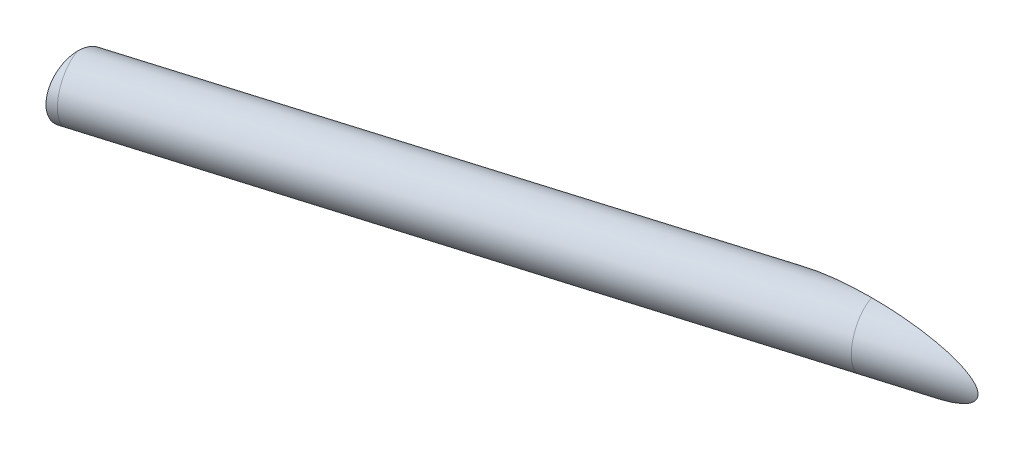
ISO-10303-21;
HEADER;
FILE_DESCRIPTION(('STEP AP214'),'2;1');
FILE_NAME('part.step','',(''),(''),'','','');
FILE_SCHEMA(('AUTOMOTIVE_DESIGN { 1 0 10303 214 1 1 1 1 }'));
ENDSEC;
DATA;
#1=APPLICATION_CONTEXT('core data for automotive mechanical design processes');
#2=APPLICATION_PROTOCOL_DEFINITION('international standard','automotive_design',2000,#1);
#3=PRODUCT_CONTEXT('',#1,'mechanical');
#4=PRODUCT('Part','Part','',(#3));
#5=PRODUCT_RELATED_PRODUCT_CATEGORY('part','',(#4));
#6=PRODUCT_DEFINITION_FORMATION('','',#4);
#7=PRODUCT_DEFINITION_CONTEXT('part definition',#1,'design');
#8=PRODUCT_DEFINITION('design','',#6,#7);
#9=PRODUCT_DEFINITION_SHAPE('','',#8);
#10=(LENGTH_UNIT() NAMED_UNIT(*) SI_UNIT(.MILLI.,.METRE.));
#11=(NAMED_UNIT(*) PLANE_ANGLE_UNIT() SI_UNIT($,.RADIAN.));
#12=(NAMED_UNIT(*) SI_UNIT($,.STERADIAN.) SOLID_ANGLE_UNIT());
#13=UNCERTAINTY_MEASURE_WITH_UNIT(LENGTH_MEASURE(1.E-05),#10,'distance_accuracy_value','');
#14=(GEOMETRIC_REPRESENTATION_CONTEXT(3) GLOBAL_UNCERTAINTY_ASSIGNED_CONTEXT((#13)) GLOBAL_UNIT_ASSIGNED_CONTEXT((#10,
#11,#12)) REPRESENTATION_CONTEXT('',''));
#15=CARTESIAN_POINT('',(0.,0.,0.));
#16=DIRECTION('',(0.,0.,1.));
#17=DIRECTION('',(1.,0.,0.));
#18=AXIS2_PLACEMENT_3D('',#15,#16,#17);
#19=CARTESIAN_POINT('',(-33.7863192501802,0.,67.2858957750541));
#20=DIRECTION('',(0.957826285221151,0.,-0.287347885566346));
#21=DIRECTION('',(-0.287347885566346,0.,-0.957826285221152));
#22=AXIS2_PLACEMENT_3D('',#19,#20,#21);
#23=CYLINDRICAL_SURFACE('',#22,8.2804);
#24=CARTESIAN_POINT('',(0.,0.,57.15));
#25=DIRECTION('',(1.,0.,0.));
#26=DIRECTION('',(0.,0.,-1.));
#27=AXIS2_PLACEMENT_3D('',#24,#25,#26);
#28=ELLIPSE('',#27,8.6449914016383,8.2804);
#29=CARTESIAN_POINT('',(0.,8.2804,57.15));
#30=VERTEX_POINT('',#29);
#31=CARTESIAN_POINT('',(0.,-8.2804,57.15));
#32=VERTEX_POINT('',#31);
#33=EDGE_CURVE('E71',#30,#32,#28,.T.);
#34=ORIENTED_EDGE('',*,*,#33,.F.);
#35=CARTESIAN_POINT('',(0.,0.,57.15));
#36=DIRECTION('',(-0.957826285221151,0.,0.287347885566346));
#37=DIRECTION('',(0.287347885566346,0.,0.957826285221151));
#38=AXIS2_PLACEMENT_3D('',#35,#36,#37);
#39=CIRCLE('',#38,8.2804);
#40=EDGE_CURVE('E86',#32,#30,#39,.T.);
#41=ORIENTED_EDGE('',*,*,#40,.F.);
#42=EDGE_LOOP('',(#34,#41));
#43=FACE_BOUND('',#42,.T.);
#44=ADVANCED_FACE('F52',(#43),#23,.F.);
#45=CARTESIAN_POINT('',(-33.7863192501802,0.,67.2858957750541));
#46=DIRECTION('',(0.957826285221151,0.,-0.287347885566346));
#47=DIRECTION('',(-0.287347885566346,0.,-0.957826285221152));
#48=AXIS2_PLACEMENT_3D('',#45,#46,#47);
#49=CYLINDRICAL_SURFACE('',#48,9.525);
#50=CARTESIAN_POINT('',(0.,0.,57.15));
#51=DIRECTION('',(-0.957826285221151,0.,0.287347885566346));
#52=DIRECTION('',(0.287347885566346,0.,0.957826285221151));
#53=AXIS2_PLACEMENT_3D('',#50,#51,#52);
#54=CIRCLE('',#53,9.525);
#55=CARTESIAN_POINT('',(0.,-9.525,57.1500000000001));
#56=VERTEX_POINT('',#55);
#57=CARTESIAN_POINT('',(0.,9.525,57.15));
#58=VERTEX_POINT('',#57);
#59=EDGE_CURVE('E83',#56,#58,#54,.T.);
#60=ORIENTED_EDGE('',*,*,#59,.T.);
#61=CARTESIAN_POINT('',(0.,0.,57.15));
#62=DIRECTION('',(1.,0.,0.));
#63=DIRECTION('',(0.,0.,-1.));
#64=AXIS2_PLACEMENT_3D('',#61,#62,#63);
#65=ELLIPSE('',#64,9.94439194973729,9.525);
#66=EDGE_CURVE('E66',#58,#56,#65,.T.);
#67=ORIENTED_EDGE('',*,*,#66,.T.);
#68=EDGE_LOOP('',(#60,#67));
#69=FACE_BOUND('',#68,.T.);
#70=ADVANCED_FACE('F82',(#69),#49,.T.);
#71=CARTESIAN_POINT('',(0.,0.,57.15));
#72=DIRECTION('',(-0.957826285221151,0.,0.287347885566346));
#73=DIRECTION('',(0.287347885566346,0.,0.957826285221151));
#74=AXIS2_PLACEMENT_3D('',#71,#72,#73);
#75=PLANE('',#74);
#76=ORIENTED_EDGE('',*,*,#59,.F.);
#77=DIRECTION('',(0.,1.,0.));
#78=VECTOR('',#77,1.);
#79=CARTESIAN_POINT('',(0.,0.,57.15));
#80=LINE('',#79,#78);
#81=EDGE_CURVE('E13',#56,#32,#80,.T.);
#82=ORIENTED_EDGE('',*,*,#81,.T.);
#83=ORIENTED_EDGE('',*,*,#40,.T.);
#84=EDGE_CURVE('E55',#30,#58,#80,.T.);
#85=ORIENTED_EDGE('',*,*,#84,.T.);
#86=EDGE_LOOP('',(#76,#82,#83,#85));
#87=FACE_BOUND('',#86,.T.);
#88=ADVANCED_FACE('F85',(#87),#75,.F.);
#89=CARTESIAN_POINT('',(0.,-9.525,90.8007127073584));
#90=DIRECTION('',(1.,0.,0.));
#91=DIRECTION('',(0.,0.,-1.));
#92=AXIS2_PLACEMENT_3D('',#89,#90,#91);
#93=PLANE('',#92);
#94=ORIENTED_EDGE('',*,*,#66,.F.);
#95=ORIENTED_EDGE('',*,*,#84,.F.);
#96=ORIENTED_EDGE('',*,*,#33,.T.);
#97=ORIENTED_EDGE('',*,*,#81,.F.);
#98=EDGE_LOOP('',(#94,#95,#96,#97));
#99=FACE_BOUND('',#98,.T.);
#100=ADVANCED_FACE('F75',(#99),#93,.F.);
#101=CLOSED_SHELL('',(#44,#70,#88,#100));
#102=MANIFOLD_SOLID_BREP('B2',#101);
#103=CARTESIAN_POINT('',(0.,0.,57.15));
#104=DIRECTION('',(0.957826285221151,0.,-0.287347885566345));
#105=DIRECTION('',(-0.287347885566345,0.,-0.957826285221151));
#106=AXIS2_PLACEMENT_3D('',#103,#104,#105);
#107=CYLINDRICAL_SURFACE('',#106,8.2804);
#108=CARTESIAN_POINT('',(190.5,0.,0.));
#109=DIRECTION('',(0.,0.,1.));
#110=DIRECTION('',(1.,0.,0.));
#111=AXIS2_PLACEMENT_3D('',#108,#109,#110);
#112=ELLIPSE('',#111,28.816638005461,8.2804);
#113=CARTESIAN_POINT('',(190.5,8.2804,0.));
#114=VERTEX_POINT('',#113);
#115=CARTESIAN_POINT('',(190.5,-8.2804,0.));
#116=VERTEX_POINT('',#115);
#117=EDGE_CURVE('E187',#114,#116,#112,.T.);
#118=ORIENTED_EDGE('',*,*,#117,.F.);
#119=CARTESIAN_POINT('',(190.5,0.,0.));
#120=DIRECTION('',(-0.957826285221151,0.,0.287347885566346));
#121=DIRECTION('',(0.287347885566346,0.,0.957826285221151));
#122=AXIS2_PLACEMENT_3D('',#119,#120,#121);
#123=CIRCLE('',#122,8.2804);
#124=EDGE_CURVE('E197',#116,#114,#123,.T.);
#125=ORIENTED_EDGE('',*,*,#124,.F.);
#126=EDGE_LOOP('',(#118,#125));
#127=FACE_BOUND('',#126,.T.);
#128=CARTESIAN_POINT('',(0.,0.,57.15));
#129=DIRECTION('',(1.,0.,0.));
#130=DIRECTION('',(0.,0.,-1.));
#131=AXIS2_PLACEMENT_3D('',#128,#129,#130);
#132=ELLIPSE('',#131,8.64499140163829,8.2804);
#133=CARTESIAN_POINT('',(0.,-8.2804,57.15));
#134=VERTEX_POINT('',#133);
#135=CARTESIAN_POINT('',(0.,8.2804,57.15));
#136=VERTEX_POINT('',#135);
#137=EDGE_CURVE('E150',#134,#136,#132,.T.);
#138=ORIENTED_EDGE('',*,*,#137,.F.);
#139=CARTESIAN_POINT('',(0.,0.,57.15));
#140=DIRECTION('',(-0.957826285221151,0.,0.287347885566346));
#141=DIRECTION('',(0.287347885566346,0.,0.957826285221151));
#142=AXIS2_PLACEMENT_3D('',#139,#140,#141);
#143=CIRCLE('',#142,8.2804);
#144=EDGE_CURVE('E191',#134,#136,#143,.T.);
#145=ORIENTED_EDGE('',*,*,#144,.T.);
#146=EDGE_LOOP('',(#138,#145));
#147=FACE_BOUND('',#146,.T.);
#148=ADVANCED_FACE('F137',(#127,#147),#107,.F.);
#149=CARTESIAN_POINT('',(0.,0.,57.15));
#150=DIRECTION('',(0.957826285221151,0.,-0.287347885566345));
#151=DIRECTION('',(-0.287347885566345,0.,-0.957826285221151));
#152=AXIS2_PLACEMENT_3D('',#149,#150,#151);
#153=CYLINDRICAL_SURFACE('',#152,9.525);
#154=CARTESIAN_POINT('',(0.,0.,57.15));
#155=DIRECTION('',(-0.957826285221151,0.,0.287347885566346));
#156=DIRECTION('',(0.287347885566346,0.,0.957826285221151));
#157=AXIS2_PLACEMENT_3D('',#154,#155,#156);
#158=CIRCLE('',#157,9.525);
#159=CARTESIAN_POINT('',(0.,-9.525,57.1500000000001));
#160=VERTEX_POINT('',#159);
#161=CARTESIAN_POINT('',(0.,9.525,57.1500000000001));
#162=VERTEX_POINT('',#161);
#163=EDGE_CURVE('E186',#160,#162,#158,.T.);
#164=ORIENTED_EDGE('',*,*,#163,.F.);
#165=CARTESIAN_POINT('',(0.,0.,57.15));
#166=DIRECTION('',(1.,0.,0.));
#167=DIRECTION('',(0.,0.,-1.));
#168=AXIS2_PLACEMENT_3D('',#165,#166,#167);
#169=ELLIPSE('',#168,9.94439194973729,9.525);
#170=EDGE_CURVE('E175',#160,#162,#169,.T.);
#171=ORIENTED_EDGE('',*,*,#170,.T.);
#172=EDGE_LOOP('',(#164,#171));
#173=FACE_BOUND('',#172,.T.);
#174=CARTESIAN_POINT('',(190.5,0.,0.));
#175=DIRECTION('',(-0.957826285221151,0.,0.287347885566346));
#176=DIRECTION('',(0.287347885566346,0.,0.957826285221151));
#177=AXIS2_PLACEMENT_3D('',#174,#175,#176);
#178=CIRCLE('',#177,9.525);
#179=CARTESIAN_POINT('',(190.5,-9.525,0.));
#180=VERTEX_POINT('',#179);
#181=CARTESIAN_POINT('',(190.5,9.525,0.));
#182=VERTEX_POINT('',#181);
#183=EDGE_CURVE('E193',#180,#182,#178,.T.);
#184=ORIENTED_EDGE('',*,*,#183,.T.);
#185=CARTESIAN_POINT('',(190.5,0.,0.));
#186=DIRECTION('',(0.,0.,1.));
#187=DIRECTION('',(1.,0.,0.));
#188=AXIS2_PLACEMENT_3D('',#185,#186,#187);
#189=ELLIPSE('',#188,33.147973165791,9.525);
#190=EDGE_CURVE('E158',#182,#180,#189,.T.);
#191=ORIENTED_EDGE('',*,*,#190,.T.);
#192=EDGE_LOOP('',(#184,#191));
#193=FACE_BOUND('',#192,.T.);
#194=ADVANCED_FACE('F184',(#173,#193),#153,.T.);
#195=CARTESIAN_POINT('',(0.,0.,57.15));
#196=DIRECTION('',(-0.957826285221151,0.,0.287347885566346));
#197=DIRECTION('',(0.287347885566346,0.,0.957826285221151));
#198=AXIS2_PLACEMENT_3D('',#195,#196,#197);
#199=PLANE('',#198);
#200=DIRECTION('',(0.,1.,0.));
#201=VECTOR('',#200,1.);
#202=CARTESIAN_POINT('',(0.,0.,57.15));
#203=LINE('',#202,#201);
#204=EDGE_CURVE('E50',#160,#134,#203,.T.);
#205=ORIENTED_EDGE('',*,*,#204,.F.);
#206=ORIENTED_EDGE('',*,*,#163,.T.);
#207=EDGE_CURVE('E140',#136,#162,#203,.T.);
#208=ORIENTED_EDGE('',*,*,#207,.F.);
#209=ORIENTED_EDGE('',*,*,#144,.F.);
#210=EDGE_LOOP('',(#205,#206,#208,#209));
#211=FACE_BOUND('',#210,.T.);
#212=ADVANCED_FACE('F189',(#211),#199,.T.);
#213=CARTESIAN_POINT('',(190.5,0.,0.));
#214=DIRECTION('',(-0.957826285221151,0.,0.287347885566346));
#215=DIRECTION('',(0.287347885566346,0.,0.957826285221151));
#216=AXIS2_PLACEMENT_3D('',#213,#214,#215);
#217=PLANE('',#216);
#218=ORIENTED_EDGE('',*,*,#183,.F.);
#219=DIRECTION('',(0.,1.,0.));
#220=VECTOR('',#219,1.);
#221=CARTESIAN_POINT('',(190.5,0.,0.));
#222=LINE('',#221,#220);
#223=EDGE_CURVE('E181',#180,#116,#222,.T.);
#224=ORIENTED_EDGE('',*,*,#223,.T.);
#225=ORIENTED_EDGE('',*,*,#124,.T.);
#226=EDGE_CURVE('E190',#114,#182,#222,.T.);
#227=ORIENTED_EDGE('',*,*,#226,.T.);
#228=EDGE_LOOP('',(#218,#224,#225,#227));
#229=FACE_BOUND('',#228,.T.);
#230=ADVANCED_FACE('F204',(#229),#217,.F.);
#231=CARTESIAN_POINT('',(0.,-9.525,0.));
#232=DIRECTION('',(0.,0.,1.));
#233=DIRECTION('',(1.,0.,0.));
#234=AXIS2_PLACEMENT_3D('',#231,#232,#233);
#235=PLANE('',#234);
#236=ORIENTED_EDGE('',*,*,#190,.F.);
#237=ORIENTED_EDGE('',*,*,#226,.F.);
#238=ORIENTED_EDGE('',*,*,#117,.T.);
#239=ORIENTED_EDGE('',*,*,#223,.F.);
#240=EDGE_LOOP('',(#236,#237,#238,#239));
#241=FACE_BOUND('',#240,.T.);
#242=ADVANCED_FACE('F207',(#241),#235,.F.);
#243=CARTESIAN_POINT('',(0.,-9.525,90.8007127073584));
#244=DIRECTION('',(1.,0.,0.));
#245=DIRECTION('',(0.,0.,-1.));
#246=AXIS2_PLACEMENT_3D('',#243,#244,#245);
#247=PLANE('',#246);
#248=ORIENTED_EDGE('',*,*,#204,.T.);
#249=ORIENTED_EDGE('',*,*,#137,.T.);
#250=ORIENTED_EDGE('',*,*,#207,.T.);
#251=ORIENTED_EDGE('',*,*,#170,.F.);
#252=EDGE_LOOP('',(#248,#249,#250,#251));
#253=FACE_BOUND('',#252,.T.);
#254=ADVANCED_FACE('F174',(#253),#247,.F.);
#255=CLOSED_SHELL('',(#148,#194,#212,#230,#242,#254));
#256=MANIFOLD_SOLID_BREP('B7',#255);
#257=CARTESIAN_POINT('',(190.5,0.,0.));
#258=DIRECTION('',(0.957826285221151,0.,-0.287347885566345));
#259=DIRECTION('',(-0.287347885566345,0.,-0.957826285221152));
#260=AXIS2_PLACEMENT_3D('',#257,#258,#259);
#261=CYLINDRICAL_SURFACE('',#260,8.2804);
#262=CARTESIAN_POINT('',(190.5,0.,0.));
#263=DIRECTION('',(0.,0.,1.));
#264=DIRECTION('',(1.,0.,0.));
#265=AXIS2_PLACEMENT_3D('',#262,#263,#264);
#266=ELLIPSE('',#265,28.816638005461,8.2804);
#267=CARTESIAN_POINT('',(190.5,-8.2804,0.));
#268=VERTEX_POINT('',#267);
#269=CARTESIAN_POINT('',(190.5,8.2804,0.));
#270=VERTEX_POINT('',#269);
#271=EDGE_CURVE('E281',#268,#270,#266,.T.);
#272=ORIENTED_EDGE('',*,*,#271,.F.);
#273=CARTESIAN_POINT('',(190.5,0.,0.));
#274=DIRECTION('',(-0.957826285221151,0.,0.287347885566346));
#275=DIRECTION('',(0.287347885566346,0.,0.957826285221151));
#276=AXIS2_PLACEMENT_3D('',#273,#274,#275);
#277=CIRCLE('',#276,8.2804);
#278=EDGE_CURVE('E302',#268,#270,#277,.T.);
#279=ORIENTED_EDGE('',*,*,#278,.T.);
#280=EDGE_LOOP('',(#272,#279));
#281=FACE_BOUND('',#280,.T.);
#282=ADVANCED_FACE('F268',(#281),#261,.F.);
#283=CARTESIAN_POINT('',(190.5,0.,0.));
#284=DIRECTION('',(0.957826285221151,0.,-0.287347885566345));
#285=DIRECTION('',(-0.287347885566345,0.,-0.957826285221152));
#286=AXIS2_PLACEMENT_3D('',#283,#284,#285);
#287=CYLINDRICAL_SURFACE('',#286,9.525);
#288=CARTESIAN_POINT('',(190.5,0.,0.));
#289=DIRECTION('',(-0.957826285221151,0.,0.287347885566346));
#290=DIRECTION('',(0.287347885566346,0.,0.957826285221151));
#291=AXIS2_PLACEMENT_3D('',#288,#289,#290);
#292=CIRCLE('',#291,9.525);
#293=CARTESIAN_POINT('',(190.5,-9.525,0.));
#294=VERTEX_POINT('',#293);
#295=CARTESIAN_POINT('',(190.5,9.525,0.));
#296=VERTEX_POINT('',#295);
#297=EDGE_CURVE('E296',#294,#296,#292,.T.);
#298=ORIENTED_EDGE('',*,*,#297,.F.);
#299=CARTESIAN_POINT('',(190.5,0.,0.));
#300=DIRECTION('',(0.,0.,1.));
#301=DIRECTION('',(1.,0.,0.));
#302=AXIS2_PLACEMENT_3D('',#299,#300,#301);
#303=ELLIPSE('',#302,33.147973165791,9.525);
#304=EDGE_CURVE('E291',#294,#296,#303,.T.);
#305=ORIENTED_EDGE('',*,*,#304,.T.);
#306=EDGE_LOOP('',(#298,#305));
#307=FACE_BOUND('',#306,.T.);
#308=ADVANCED_FACE('F299',(#307),#287,.T.);
#309=CARTESIAN_POINT('',(190.5,0.,0.));
#310=DIRECTION('',(-0.957826285221151,0.,0.287347885566346));
#311=DIRECTION('',(0.287347885566346,0.,0.957826285221151));
#312=AXIS2_PLACEMENT_3D('',#309,#310,#311);
#313=PLANE('',#312);
#314=DIRECTION('',(0.,1.,0.));
#315=VECTOR('',#314,1.);
#316=CARTESIAN_POINT('',(190.5,0.,0.));
#317=LINE('',#316,#315);
#318=EDGE_CURVE('E135',#294,#268,#317,.T.);
#319=ORIENTED_EDGE('',*,*,#318,.F.);
#320=ORIENTED_EDGE('',*,*,#297,.T.);
#321=EDGE_CURVE('E271',#270,#296,#317,.T.);
#322=ORIENTED_EDGE('',*,*,#321,.F.);
#323=ORIENTED_EDGE('',*,*,#278,.F.);
#324=EDGE_LOOP('',(#319,#320,#322,#323));
#325=FACE_BOUND('',#324,.T.);
#326=ADVANCED_FACE('F301',(#325),#313,.T.);
#327=CARTESIAN_POINT('',(0.,-9.525,0.));
#328=DIRECTION('',(0.,0.,1.));
#329=DIRECTION('',(1.,0.,0.));
#330=AXIS2_PLACEMENT_3D('',#327,#328,#329);
#331=PLANE('',#330);
#332=ORIENTED_EDGE('',*,*,#318,.T.);
#333=ORIENTED_EDGE('',*,*,#271,.T.);
#334=ORIENTED_EDGE('',*,*,#321,.T.);
#335=ORIENTED_EDGE('',*,*,#304,.F.);
#336=EDGE_LOOP('',(#332,#333,#334,#335));
#337=FACE_BOUND('',#336,.T.);
#338=ADVANCED_FACE('F290',(#337),#331,.F.);
#339=CLOSED_SHELL('',(#282,#308,#326,#338));
#340=MANIFOLD_SOLID_BREP('B44',#339);
#341=ADVANCED_BREP_SHAPE_REPRESENTATION('',(#18,#102,#256,#340),#14);
#342=SHAPE_DEFINITION_REPRESENTATION(#9,#341);
ENDSEC;
END-ISO-10303-21;
